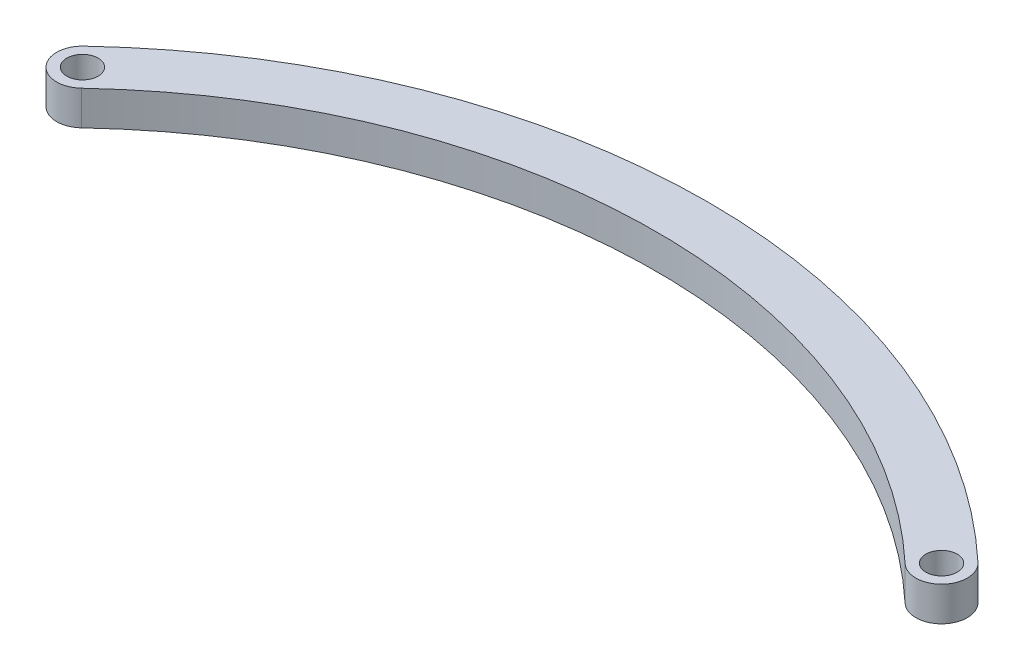
ISO-10303-21;
HEADER;
FILE_DESCRIPTION(('STEP AP214'),'2;1');
FILE_NAME('part.step','',(''),(''),'','','');
FILE_SCHEMA(('AUTOMOTIVE_DESIGN { 1 0 10303 214 1 1 1 1 }'));
ENDSEC;
DATA;
#1=APPLICATION_CONTEXT('core data for automotive mechanical design processes');
#2=APPLICATION_PROTOCOL_DEFINITION('international standard','automotive_design',2000,#1);
#3=PRODUCT_CONTEXT('',#1,'mechanical');
#4=PRODUCT('Part','Part','',(#3));
#5=PRODUCT_RELATED_PRODUCT_CATEGORY('part','',(#4));
#6=PRODUCT_DEFINITION_FORMATION('','',#4);
#7=PRODUCT_DEFINITION_CONTEXT('part definition',#1,'design');
#8=PRODUCT_DEFINITION('design','',#6,#7);
#9=PRODUCT_DEFINITION_SHAPE('','',#8);
#10=(LENGTH_UNIT() NAMED_UNIT(*) SI_UNIT(.MILLI.,.METRE.));
#11=(NAMED_UNIT(*) PLANE_ANGLE_UNIT() SI_UNIT($,.RADIAN.));
#12=(NAMED_UNIT(*) SI_UNIT($,.STERADIAN.) SOLID_ANGLE_UNIT());
#13=UNCERTAINTY_MEASURE_WITH_UNIT(LENGTH_MEASURE(1.E-05),#10,'distance_accuracy_value','');
#14=(GEOMETRIC_REPRESENTATION_CONTEXT(3) GLOBAL_UNCERTAINTY_ASSIGNED_CONTEXT((#13)) GLOBAL_UNIT_ASSIGNED_CONTEXT((#10,
#11,#12)) REPRESENTATION_CONTEXT('',''));
#15=CARTESIAN_POINT('',(0.,0.,0.));
#16=DIRECTION('',(0.,0.,1.));
#17=DIRECTION('',(1.,0.,0.));
#18=AXIS2_PLACEMENT_3D('',#15,#16,#17);
#19=CARTESIAN_POINT('',(0.,4.,53.1883445878888));
#20=DIRECTION('',(0.,-1.,0.));
#21=DIRECTION('',(0.,0.,-1.));
#22=AXIS2_PLACEMENT_3D('',#19,#20,#21);
#23=CYLINDRICAL_SURFACE('',#22,70.);
#24=CARTESIAN_POINT('',(0.,0.,53.1883445878888));
#25=DIRECTION('',(0.,1.,0.));
#26=DIRECTION('',(0.,0.,1.));
#27=AXIS2_PLACEMENT_3D('',#24,#25,#26);
#28=CIRCLE('',#27,70.);
#29=CARTESIAN_POINT('',(47.9452054794521,0.,2.1858223803242));
#30=VERTEX_POINT('',#29);
#31=CARTESIAN_POINT('',(-47.9452054794521,0.,2.1858223803242));
#32=VERTEX_POINT('',#31);
#33=EDGE_CURVE('E106',#30,#32,#28,.T.);
#34=ORIENTED_EDGE('',*,*,#33,.F.);
#35=DIRECTION('',(0.,-1.,0.));
#36=VECTOR('',#35,1.);
#37=CARTESIAN_POINT('',(47.9452054794521,4.,2.1858223803242));
#38=LINE('',#37,#36);
#39=CARTESIAN_POINT('',(47.9452054794521,4.,2.1858223803242));
#40=VERTEX_POINT('',#39);
#41=EDGE_CURVE('E11',#40,#30,#38,.T.);
#42=ORIENTED_EDGE('',*,*,#41,.F.);
#43=CARTESIAN_POINT('',(0.,4.,53.1883445878888));
#44=DIRECTION('',(0.,1.,0.));
#45=DIRECTION('',(0.,0.,1.));
#46=AXIS2_PLACEMENT_3D('',#43,#44,#45);
#47=CIRCLE('',#46,70.);
#48=CARTESIAN_POINT('',(-47.9452054794521,4.,2.1858223803242));
#49=VERTEX_POINT('',#48);
#50=EDGE_CURVE('E88',#40,#49,#47,.T.);
#51=ORIENTED_EDGE('',*,*,#50,.T.);
#52=DIRECTION('',(0.,-1.,0.));
#53=VECTOR('',#52,1.);
#54=CARTESIAN_POINT('',(-47.9452054794521,4.,2.1858223803242));
#55=LINE('',#54,#53);
#56=EDGE_CURVE('E76',#49,#32,#55,.T.);
#57=ORIENTED_EDGE('',*,*,#56,.T.);
#58=EDGE_LOOP('',(#34,#42,#51,#57));
#59=FACE_BOUND('',#58,.T.);
#60=ADVANCED_FACE('F37',(#59),#23,.F.);
#61=CARTESIAN_POINT('',(50.,4.,0.));
#62=DIRECTION('',(0.,-1.,0.));
#63=DIRECTION('',(0.,0.,-1.));
#64=AXIS2_PLACEMENT_3D('',#61,#62,#63);
#65=CYLINDRICAL_SURFACE('',#64,3.);
#66=CARTESIAN_POINT('',(50.,0.,0.));
#67=DIRECTION('',(0.,1.,0.));
#68=DIRECTION('',(0.,0.,1.));
#69=AXIS2_PLACEMENT_3D('',#66,#67,#68);
#70=CIRCLE('',#69,3.);
#71=CARTESIAN_POINT('',(52.0547945205479,0.,-2.1858223803242));
#72=VERTEX_POINT('',#71);
#73=EDGE_CURVE('E93',#30,#72,#70,.T.);
#74=ORIENTED_EDGE('',*,*,#73,.T.);
#75=DIRECTION('',(0.,-1.,0.));
#76=VECTOR('',#75,1.);
#77=CARTESIAN_POINT('',(52.0547945205479,4.,-2.1858223803242));
#78=LINE('',#77,#76);
#79=CARTESIAN_POINT('',(52.0547945205479,4.,-2.1858223803242));
#80=VERTEX_POINT('',#79);
#81=EDGE_CURVE('E45',#80,#72,#78,.T.);
#82=ORIENTED_EDGE('',*,*,#81,.F.);
#83=CARTESIAN_POINT('',(50.,4.,0.));
#84=DIRECTION('',(0.,1.,0.));
#85=DIRECTION('',(0.,0.,1.));
#86=AXIS2_PLACEMENT_3D('',#83,#84,#85);
#87=CIRCLE('',#86,3.);
#88=EDGE_CURVE('E82',#40,#80,#87,.T.);
#89=ORIENTED_EDGE('',*,*,#88,.F.);
#90=ORIENTED_EDGE('',*,*,#41,.T.);
#91=EDGE_LOOP('',(#74,#82,#89,#90));
#92=FACE_BOUND('',#91,.T.);
#93=ADVANCED_FACE('F91',(#92),#65,.T.);
#94=CARTESIAN_POINT('',(0.,4.,53.1883445878888));
#95=DIRECTION('',(0.,-1.,0.));
#96=DIRECTION('',(0.,0.,-1.));
#97=AXIS2_PLACEMENT_3D('',#94,#95,#96);
#98=CYLINDRICAL_SURFACE('',#97,76.);
#99=CARTESIAN_POINT('',(0.,0.,53.1883445878888));
#100=DIRECTION('',(0.,1.,0.));
#101=DIRECTION('',(0.,0.,1.));
#102=AXIS2_PLACEMENT_3D('',#99,#100,#101);
#103=CIRCLE('',#102,76.);
#104=CARTESIAN_POINT('',(-52.0547945205479,0.,-2.1858223803242));
#105=VERTEX_POINT('',#104);
#106=EDGE_CURVE('E69',#72,#105,#103,.T.);
#107=ORIENTED_EDGE('',*,*,#106,.T.);
#108=DIRECTION('',(0.,-1.,0.));
#109=VECTOR('',#108,1.);
#110=CARTESIAN_POINT('',(-52.0547945205479,4.,-2.1858223803242));
#111=LINE('',#110,#109);
#112=CARTESIAN_POINT('',(-52.0547945205479,4.,-2.1858223803242));
#113=VERTEX_POINT('',#112);
#114=EDGE_CURVE('E94',#113,#105,#111,.T.);
#115=ORIENTED_EDGE('',*,*,#114,.F.);
#116=CARTESIAN_POINT('',(0.,4.,53.1883445878888));
#117=DIRECTION('',(0.,1.,0.));
#118=DIRECTION('',(0.,0.,1.));
#119=AXIS2_PLACEMENT_3D('',#116,#117,#118);
#120=CIRCLE('',#119,76.);
#121=EDGE_CURVE('E87',#80,#113,#120,.T.);
#122=ORIENTED_EDGE('',*,*,#121,.F.);
#123=ORIENTED_EDGE('',*,*,#81,.T.);
#124=EDGE_LOOP('',(#107,#115,#122,#123));
#125=FACE_BOUND('',#124,.T.);
#126=ADVANCED_FACE('F95',(#125),#98,.T.);
#127=CARTESIAN_POINT('',(-50.,4.,0.));
#128=DIRECTION('',(0.,-1.,0.));
#129=DIRECTION('',(0.,0.,-1.));
#130=AXIS2_PLACEMENT_3D('',#127,#128,#129);
#131=CYLINDRICAL_SURFACE('',#130,1.825);
#132=CARTESIAN_POINT('',(-50.,4.,0.));
#133=DIRECTION('',(0.,1.,0.));
#134=DIRECTION('',(0.,0.,1.));
#135=AXIS2_PLACEMENT_3D('',#132,#133,#134);
#136=CIRCLE('',#135,1.825);
#137=CARTESIAN_POINT('',(-50.,4.,1.825));
#138=VERTEX_POINT('',#137);
#139=EDGE_CURVE('E97',#138,#138,#136,.T.);
#140=ORIENTED_EDGE('',*,*,#139,.T.);
#141=EDGE_LOOP('',(#140));
#142=FACE_BOUND('',#141,.T.);
#143=CARTESIAN_POINT('',(-50.,0.,0.));
#144=DIRECTION('',(0.,1.,0.));
#145=DIRECTION('',(0.,0.,1.));
#146=AXIS2_PLACEMENT_3D('',#143,#144,#145);
#147=CIRCLE('',#146,1.825);
#148=CARTESIAN_POINT('',(-50.,0.,1.825));
#149=VERTEX_POINT('',#148);
#150=EDGE_CURVE('E113',#149,#149,#147,.T.);
#151=ORIENTED_EDGE('',*,*,#150,.F.);
#152=EDGE_LOOP('',(#151));
#153=FACE_BOUND('',#152,.T.);
#154=ADVANCED_FACE('F133',(#142,#153),#131,.F.);
#155=CARTESIAN_POINT('',(-50.,4.,0.));
#156=DIRECTION('',(0.,-1.,0.));
#157=DIRECTION('',(0.,0.,-1.));
#158=AXIS2_PLACEMENT_3D('',#155,#156,#157);
#159=CYLINDRICAL_SURFACE('',#158,3.);
#160=CARTESIAN_POINT('',(-50.,0.,0.));
#161=DIRECTION('',(0.,1.,0.));
#162=DIRECTION('',(0.,0.,1.));
#163=AXIS2_PLACEMENT_3D('',#160,#161,#162);
#164=CIRCLE('',#163,3.);
#165=EDGE_CURVE('E111',#105,#32,#164,.T.);
#166=ORIENTED_EDGE('',*,*,#165,.T.);
#167=ORIENTED_EDGE('',*,*,#56,.F.);
#168=CARTESIAN_POINT('',(-50.,4.,0.));
#169=DIRECTION('',(0.,1.,0.));
#170=DIRECTION('',(0.,0.,1.));
#171=AXIS2_PLACEMENT_3D('',#168,#169,#170);
#172=CIRCLE('',#171,3.);
#173=EDGE_CURVE('E53',#113,#49,#172,.T.);
#174=ORIENTED_EDGE('',*,*,#173,.F.);
#175=ORIENTED_EDGE('',*,*,#114,.T.);
#176=EDGE_LOOP('',(#166,#167,#174,#175));
#177=FACE_BOUND('',#176,.T.);
#178=ADVANCED_FACE('F122',(#177),#159,.T.);
#179=CARTESIAN_POINT('',(50.,4.,0.));
#180=DIRECTION('',(0.,-1.,0.));
#181=DIRECTION('',(0.,0.,-1.));
#182=AXIS2_PLACEMENT_3D('',#179,#180,#181);
#183=CYLINDRICAL_SURFACE('',#182,1.825);
#184=CARTESIAN_POINT('',(50.,4.,0.));
#185=DIRECTION('',(0.,1.,0.));
#186=DIRECTION('',(0.,0.,1.));
#187=AXIS2_PLACEMENT_3D('',#184,#185,#186);
#188=CIRCLE('',#187,1.825);
#189=CARTESIAN_POINT('',(50.,4.,1.825));
#190=VERTEX_POINT('',#189);
#191=EDGE_CURVE('E103',#190,#190,#188,.T.);
#192=ORIENTED_EDGE('',*,*,#191,.T.);
#193=EDGE_LOOP('',(#192));
#194=FACE_BOUND('',#193,.T.);
#195=CARTESIAN_POINT('',(50.,0.,0.));
#196=DIRECTION('',(0.,1.,0.));
#197=DIRECTION('',(0.,0.,1.));
#198=AXIS2_PLACEMENT_3D('',#195,#196,#197);
#199=CIRCLE('',#198,1.825);
#200=CARTESIAN_POINT('',(50.,0.,1.825));
#201=VERTEX_POINT('',#200);
#202=EDGE_CURVE('E116',#201,#201,#199,.T.);
#203=ORIENTED_EDGE('',*,*,#202,.F.);
#204=EDGE_LOOP('',(#203));
#205=FACE_BOUND('',#204,.T.);
#206=ADVANCED_FACE('F138',(#194,#205),#183,.F.);
#207=CARTESIAN_POINT('',(0.,4.,0.));
#208=DIRECTION('',(0.,1.,0.));
#209=DIRECTION('',(0.,0.,1.));
#210=AXIS2_PLACEMENT_3D('',#207,#208,#209);
#211=PLANE('',#210);
#212=ORIENTED_EDGE('',*,*,#50,.F.);
#213=ORIENTED_EDGE('',*,*,#88,.T.);
#214=ORIENTED_EDGE('',*,*,#121,.T.);
#215=ORIENTED_EDGE('',*,*,#173,.T.);
#216=EDGE_LOOP('',(#212,#213,#214,#215));
#217=FACE_BOUND('',#216,.T.);
#218=ORIENTED_EDGE('',*,*,#139,.F.);
#219=EDGE_LOOP('',(#218));
#220=FACE_BOUND('',#219,.T.);
#221=ORIENTED_EDGE('',*,*,#191,.F.);
#222=EDGE_LOOP('',(#221));
#223=FACE_BOUND('',#222,.T.);
#224=ADVANCED_FACE('F84',(#217,#220,#223),#211,.T.);
#225=CARTESIAN_POINT('',(0.,0.,0.));
#226=DIRECTION('',(0.,1.,0.));
#227=DIRECTION('',(0.,0.,1.));
#228=AXIS2_PLACEMENT_3D('',#225,#226,#227);
#229=PLANE('',#228);
#230=ORIENTED_EDGE('',*,*,#33,.T.);
#231=ORIENTED_EDGE('',*,*,#165,.F.);
#232=ORIENTED_EDGE('',*,*,#106,.F.);
#233=ORIENTED_EDGE('',*,*,#73,.F.);
#234=EDGE_LOOP('',(#230,#231,#232,#233));
#235=FACE_BOUND('',#234,.T.);
#236=ORIENTED_EDGE('',*,*,#150,.T.);
#237=EDGE_LOOP('',(#236));
#238=FACE_BOUND('',#237,.T.);
#239=ORIENTED_EDGE('',*,*,#202,.T.);
#240=EDGE_LOOP('',(#239));
#241=FACE_BOUND('',#240,.T.);
#242=ADVANCED_FACE('F124',(#235,#238,#241),#229,.F.);
#243=CLOSED_SHELL('',(#60,#93,#126,#154,#178,#206,#224,#242));
#244=MANIFOLD_SOLID_BREP('B2',#243);
#245=ADVANCED_BREP_SHAPE_REPRESENTATION('',(#18,#244),#14);
#246=SHAPE_DEFINITION_REPRESENTATION(#9,#245);
ENDSEC;
END-ISO-10303-21;
